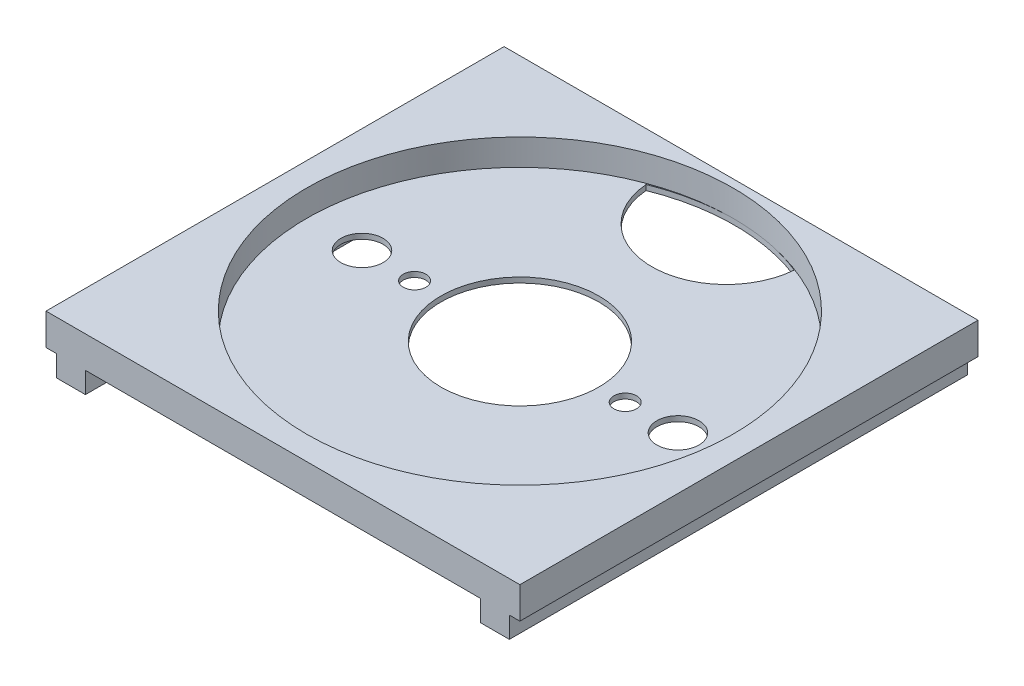
ISO-10303-21;
HEADER;
FILE_DESCRIPTION(('STEP AP214'),'2;1');
FILE_NAME('part.step','',(''),(''),'','','');
FILE_SCHEMA(('AUTOMOTIVE_DESIGN { 1 0 10303 214 1 1 1 1 }'));
ENDSEC;
DATA;
#1=APPLICATION_CONTEXT('core data for automotive mechanical design processes');
#2=APPLICATION_PROTOCOL_DEFINITION('international standard','automotive_design',2000,#1);
#3=PRODUCT_CONTEXT('',#1,'mechanical');
#4=PRODUCT('Part','Part','',(#3));
#5=PRODUCT_RELATED_PRODUCT_CATEGORY('part','',(#4));
#6=PRODUCT_DEFINITION_FORMATION('','',#4);
#7=PRODUCT_DEFINITION_CONTEXT('part definition',#1,'design');
#8=PRODUCT_DEFINITION('design','',#6,#7);
#9=PRODUCT_DEFINITION_SHAPE('','',#8);
#10=(LENGTH_UNIT() NAMED_UNIT(*) SI_UNIT(.MILLI.,.METRE.));
#11=(NAMED_UNIT(*) PLANE_ANGLE_UNIT() SI_UNIT($,.RADIAN.));
#12=(NAMED_UNIT(*) SI_UNIT($,.STERADIAN.) SOLID_ANGLE_UNIT());
#13=UNCERTAINTY_MEASURE_WITH_UNIT(LENGTH_MEASURE(1.E-05),#10,'distance_accuracy_value','');
#14=(GEOMETRIC_REPRESENTATION_CONTEXT(3) GLOBAL_UNCERTAINTY_ASSIGNED_CONTEXT((#13)) GLOBAL_UNIT_ASSIGNED_CONTEXT((#10,
#11,#12)) REPRESENTATION_CONTEXT('',''));
#15=CARTESIAN_POINT('',(0.,0.,0.));
#16=DIRECTION('',(0.,0.,1.));
#17=DIRECTION('',(1.,0.,0.));
#18=AXIS2_PLACEMENT_3D('',#15,#16,#17);
#19=CARTESIAN_POINT('',(0.,5.,0.));
#20=DIRECTION('',(0.,1.,0.));
#21=DIRECTION('',(0.,0.,1.));
#22=AXIS2_PLACEMENT_3D('',#19,#20,#21);
#23=CYLINDRICAL_SURFACE('',#22,40.5);
#24=CARTESIAN_POINT('',(0.,5.,0.));
#25=DIRECTION('',(0.,1.,0.));
#26=DIRECTION('',(0.,0.,1.));
#27=AXIS2_PLACEMENT_3D('',#24,#25,#26);
#28=CIRCLE('',#27,40.5);
#29=CARTESIAN_POINT('',(7.96690062199776,5.,-39.7086702683332));
#30=VERTEX_POINT('',#29);
#31=CARTESIAN_POINT('',(-0.453204015702651,5.,-40.4974641937017));
#32=VERTEX_POINT('',#31);
#33=EDGE_CURVE('E340',#30,#32,#28,.T.);
#34=ORIENTED_EDGE('',*,*,#33,.F.);
#35=EDGE_CURVE('E225',#32,#30,#28,.T.);
#36=ORIENTED_EDGE('',*,*,#35,.F.);
#37=EDGE_LOOP('',(#34,#36));
#38=FACE_BOUND('',#37,.T.);
#39=CARTESIAN_POINT('',(0.,10.,0.));
#40=DIRECTION('',(0.,1.,0.));
#41=DIRECTION('',(0.,0.,1.));
#42=AXIS2_PLACEMENT_3D('',#39,#40,#41);
#43=CIRCLE('',#42,40.5);
#44=CARTESIAN_POINT('',(0.,10.,40.5));
#45=VERTEX_POINT('',#44);
#46=EDGE_CURVE('E185',#45,#45,#43,.T.);
#47=ORIENTED_EDGE('',*,*,#46,.T.);
#48=EDGE_LOOP('',(#47));
#49=FACE_BOUND('',#48,.T.);
#50=ADVANCED_FACE('F55',(#38,#49),#23,.F.);
#51=CARTESIAN_POINT('',(20.,3.,0.));
#52=DIRECTION('',(0.,1.,0.));
#53=DIRECTION('',(0.,0.,1.));
#54=AXIS2_PLACEMENT_3D('',#51,#52,#53);
#55=CYLINDRICAL_SURFACE('',#54,2.15);
#56=CARTESIAN_POINT('',(20.,5.,0.));
#57=DIRECTION('',(0.,1.,0.));
#58=DIRECTION('',(0.,0.,1.));
#59=AXIS2_PLACEMENT_3D('',#56,#57,#58);
#60=CIRCLE('',#59,2.15);
#61=CARTESIAN_POINT('',(20.,5.,2.15));
#62=VERTEX_POINT('',#61);
#63=EDGE_CURVE('E353',#62,#62,#60,.T.);
#64=ORIENTED_EDGE('',*,*,#63,.T.);
#65=EDGE_LOOP('',(#64));
#66=FACE_BOUND('',#65,.T.);
#67=CARTESIAN_POINT('',(20.,4.,0.));
#68=DIRECTION('',(0.,-1.,0.));
#69=DIRECTION('',(0.,0.,-1.));
#70=AXIS2_PLACEMENT_3D('',#67,#68,#69);
#71=CIRCLE('',#70,2.15);
#72=CARTESIAN_POINT('',(20.,4.,-2.15));
#73=VERTEX_POINT('',#72);
#74=EDGE_CURVE('E319',#73,#73,#71,.F.);
#75=ORIENTED_EDGE('',*,*,#74,.F.);
#76=EDGE_LOOP('',(#75));
#77=FACE_BOUND('',#76,.T.);
#78=ADVANCED_FACE('F425',(#66,#77),#55,.F.);
#79=CARTESIAN_POINT('',(-20.,3.,0.));
#80=DIRECTION('',(0.,1.,0.));
#81=DIRECTION('',(0.,0.,1.));
#82=AXIS2_PLACEMENT_3D('',#79,#80,#81);
#83=CYLINDRICAL_SURFACE('',#82,2.15);
#84=CARTESIAN_POINT('',(-20.,5.,0.));
#85=DIRECTION('',(0.,1.,0.));
#86=DIRECTION('',(0.,0.,1.));
#87=AXIS2_PLACEMENT_3D('',#84,#85,#86);
#88=CIRCLE('',#87,2.15);
#89=CARTESIAN_POINT('',(-20.,5.,2.15));
#90=VERTEX_POINT('',#89);
#91=EDGE_CURVE('E349',#90,#90,#88,.T.);
#92=ORIENTED_EDGE('',*,*,#91,.T.);
#93=EDGE_LOOP('',(#92));
#94=FACE_BOUND('',#93,.T.);
#95=CARTESIAN_POINT('',(-20.,4.,0.));
#96=DIRECTION('',(0.,-1.,0.));
#97=DIRECTION('',(0.,0.,-1.));
#98=AXIS2_PLACEMENT_3D('',#95,#96,#97);
#99=CIRCLE('',#98,2.15);
#100=CARTESIAN_POINT('',(-20.,4.,-2.15));
#101=VERTEX_POINT('',#100);
#102=EDGE_CURVE('E230',#101,#101,#99,.F.);
#103=ORIENTED_EDGE('',*,*,#102,.F.);
#104=EDGE_LOOP('',(#103));
#105=FACE_BOUND('',#104,.T.);
#106=ADVANCED_FACE('F612',(#94,#105),#83,.F.);
#107=CARTESIAN_POINT('',(0.,0.,0.));
#108=DIRECTION('',(0.,1.,0.));
#109=DIRECTION('',(0.,0.,1.));
#110=AXIS2_PLACEMENT_3D('',#107,#108,#109);
#111=CYLINDRICAL_SURFACE('',#110,15.);
#112=CARTESIAN_POINT('',(0.,5.,0.));
#113=DIRECTION('',(0.,1.,0.));
#114=DIRECTION('',(0.,0.,1.));
#115=AXIS2_PLACEMENT_3D('',#112,#113,#114);
#116=CIRCLE('',#115,15.);
#117=CARTESIAN_POINT('',(0.,5.,15.));
#118=VERTEX_POINT('',#117);
#119=EDGE_CURVE('E345',#118,#118,#116,.T.);
#120=ORIENTED_EDGE('',*,*,#119,.T.);
#121=EDGE_LOOP('',(#120));
#122=FACE_BOUND('',#121,.T.);
#123=CARTESIAN_POINT('',(0.,4.,0.));
#124=DIRECTION('',(0.,-1.,0.));
#125=DIRECTION('',(0.,0.,-1.));
#126=AXIS2_PLACEMENT_3D('',#123,#124,#125);
#127=CIRCLE('',#126,15.);
#128=CARTESIAN_POINT('',(0.,4.,-15.));
#129=VERTEX_POINT('',#128);
#130=EDGE_CURVE('E226',#129,#129,#127,.F.);
#131=ORIENTED_EDGE('',*,*,#130,.F.);
#132=EDGE_LOOP('',(#131));
#133=FACE_BOUND('',#132,.T.);
#134=ADVANCED_FACE('F446',(#122,#133),#111,.F.);
#135=CARTESIAN_POINT('',(30.0323396507021,-5.,0.0225134709915971));
#136=DIRECTION('',(0.,1.,0.));
#137=DIRECTION('',(0.,0.,1.));
#138=AXIS2_PLACEMENT_3D('',#135,#136,#137);
#139=CYLINDRICAL_SURFACE('',#138,4.00000000000001);
#140=CARTESIAN_POINT('',(30.0323396507021,4.,0.0225134709915971));
#141=DIRECTION('',(0.,-1.,0.));
#142=DIRECTION('',(0.,0.,-1.));
#143=AXIS2_PLACEMENT_3D('',#140,#141,#142);
#144=CIRCLE('',#143,4.00000000000001);
#145=CARTESIAN_POINT('',(30.0323396507021,4.,-3.97748652900842));
#146=VERTEX_POINT('',#145);
#147=EDGE_CURVE('E237',#146,#146,#144,.T.);
#148=ORIENTED_EDGE('',*,*,#147,.T.);
#149=EDGE_LOOP('',(#148));
#150=FACE_BOUND('',#149,.T.);
#151=CARTESIAN_POINT('',(30.0323396507021,5.,0.0225134709915971));
#152=DIRECTION('',(0.,1.,0.));
#153=DIRECTION('',(0.,0.,1.));
#154=AXIS2_PLACEMENT_3D('',#151,#152,#153);
#155=CIRCLE('',#154,4.00000000000001);
#156=CARTESIAN_POINT('',(30.0323396507021,5.,4.02251347099161));
#157=VERTEX_POINT('',#156);
#158=EDGE_CURVE('E232',#157,#157,#155,.T.);
#159=ORIENTED_EDGE('',*,*,#158,.T.);
#160=EDGE_LOOP('',(#159));
#161=FACE_BOUND('',#160,.T.);
#162=ADVANCED_FACE('F390',(#150,#161),#139,.F.);
#163=CARTESIAN_POINT('',(0.234545087504077,5.,-20.721427314011));
#164=DIRECTION('',(0.,1.,0.));
#165=DIRECTION('',(0.,0.,1.));
#166=AXIS2_PLACEMENT_3D('',#163,#164,#165);
#167=PLANE('',#166);
#168=CARTESIAN_POINT('',(0.234545087504078,5.,-2.50368837224554));
#169=DIRECTION('',(0.,-1.,0.));
#170=DIRECTION('',(0.,0.,-1.));
#171=AXIS2_PLACEMENT_3D('',#168,#169,#170);
#172=CIRCLE('',#171,38.0000000000004);
#173=EDGE_CURVE('E236',#32,#30,#172,.T.);
#174=ORIENTED_EDGE('',*,*,#173,.T.);
#175=ORIENTED_EDGE('',*,*,#33,.T.);
#176=EDGE_LOOP('',(#174,#175));
#177=FACE_BOUND('',#176,.T.);
#178=ADVANCED_FACE('F419',(#177),#167,.F.);
#179=CARTESIAN_POINT('',(0.,5.,0.));
#180=DIRECTION('',(0.,1.,0.));
#181=DIRECTION('',(0.,0.,1.));
#182=AXIS2_PLACEMENT_3D('',#179,#180,#181);
#183=PLANE('',#182);
#184=CARTESIAN_POINT('',(-29.9676603492979,5.,0.0225134709915971));
#185=DIRECTION('',(0.,1.,0.));
#186=DIRECTION('',(0.,0.,1.));
#187=AXIS2_PLACEMENT_3D('',#184,#185,#186);
#188=CIRCLE('',#187,4.);
#189=CARTESIAN_POINT('',(-29.9676603492979,5.,4.0225134709916));
#190=VERTEX_POINT('',#189);
#191=EDGE_CURVE('E238',#190,#190,#188,.T.);
#192=ORIENTED_EDGE('',*,*,#191,.F.);
#193=EDGE_LOOP('',(#192));
#194=FACE_BOUND('',#193,.T.);
#195=ORIENTED_EDGE('',*,*,#158,.F.);
#196=EDGE_LOOP('',(#195));
#197=FACE_BOUND('',#196,.T.);
#198=ORIENTED_EDGE('',*,*,#119,.F.);
#199=EDGE_LOOP('',(#198));
#200=FACE_BOUND('',#199,.T.);
#201=ORIENTED_EDGE('',*,*,#91,.F.);
#202=EDGE_LOOP('',(#201));
#203=FACE_BOUND('',#202,.T.);
#204=ORIENTED_EDGE('',*,*,#63,.F.);
#205=EDGE_LOOP('',(#204));
#206=FACE_BOUND('',#205,.T.);
#207=CARTESIAN_POINT('',(0.234545087504076,5.,-38.9391662557764));
#208=DIRECTION('',(0.,1.,0.));
#209=DIRECTION('',(0.,0.,1.));
#210=AXIS2_PLACEMENT_3D('',#207,#208,#209);
#211=CIRCLE('',#210,14.1220477581371);
#212=CARTESIAN_POINT('',(-13.8415216151434,5.,-37.800491997824));
#213=VERTEX_POINT('',#212);
#214=CARTESIAN_POINT('',(14.3106117901516,5.,-37.800491997824));
#215=VERTEX_POINT('',#214);
#216=EDGE_CURVE('E331',#213,#215,#211,.T.);
#217=ORIENTED_EDGE('',*,*,#216,.F.);
#218=EDGE_CURVE('E336',#213,#32,#172,.T.);
#219=ORIENTED_EDGE('',*,*,#218,.T.);
#220=ORIENTED_EDGE('',*,*,#35,.T.);
#221=CARTESIAN_POINT('',(0.234545087504078,5.,-2.50368837224554));
#222=DIRECTION('',(0.,1.,0.));
#223=DIRECTION('',(0.,0.,1.));
#224=AXIS2_PLACEMENT_3D('',#221,#222,#223);
#225=CIRCLE('',#224,38.0000000000004);
#226=EDGE_CURVE('E220',#30,#215,#225,.F.);
#227=ORIENTED_EDGE('',*,*,#226,.T.);
#228=EDGE_LOOP('',(#217,#219,#220,#227));
#229=FACE_BOUND('',#228,.T.);
#230=ADVANCED_FACE('F413',(#194,#197,#200,#203,#206,#229),#183,.T.);
#231=CARTESIAN_POINT('',(0.234545087504078,-61.,-2.50368837224554));
#232=DIRECTION('',(0.,1.,0.));
#233=DIRECTION('',(0.,0.,1.));
#234=AXIS2_PLACEMENT_3D('',#231,#232,#233);
#235=CYLINDRICAL_SURFACE('',#234,38.0000000000004);
#236=DIRECTION('',(0.,1.,0.));
#237=VECTOR('',#236,1.);
#238=CARTESIAN_POINT('',(-13.8415216151434,-61.,-37.800491997824));
#239=LINE('',#238,#237);
#240=CARTESIAN_POINT('',(-13.8415216151434,4.00000000000007,-37.800491997824));
#241=VERTEX_POINT('',#240);
#242=EDGE_CURVE('E335',#241,#213,#239,.T.);
#243=ORIENTED_EDGE('',*,*,#242,.F.);
#244=CARTESIAN_POINT('',(0.234545087504078,4.00000000000012,-2.50368837224554));
#245=DIRECTION('',(0.,-1.,0.));
#246=DIRECTION('',(1.,0.,0.));
#247=AXIS2_PLACEMENT_3D('',#244,#245,#246);
#248=CIRCLE('',#247,38.0000000000004);
#249=CARTESIAN_POINT('',(14.3106117901516,4.00000000000025,-37.800491997824));
#250=VERTEX_POINT('',#249);
#251=EDGE_CURVE('E224',#241,#250,#248,.T.);
#252=ORIENTED_EDGE('',*,*,#251,.T.);
#253=DIRECTION('',(0.,1.,0.));
#254=VECTOR('',#253,1.);
#255=CARTESIAN_POINT('',(14.3106117901516,-61.,-37.800491997824));
#256=LINE('',#255,#254);
#257=EDGE_CURVE('E250',#250,#215,#256,.T.);
#258=ORIENTED_EDGE('',*,*,#257,.T.);
#259=ORIENTED_EDGE('',*,*,#226,.F.);
#260=ORIENTED_EDGE('',*,*,#173,.F.);
#261=ORIENTED_EDGE('',*,*,#218,.F.);
#262=EDGE_LOOP('',(#243,#252,#258,#259,#260,#261));
#263=FACE_BOUND('',#262,.T.);
#264=ADVANCED_FACE('F407',(#263),#235,.F.);
#265=CARTESIAN_POINT('',(0.234545087504076,-61.,-38.9391662557764));
#266=DIRECTION('',(0.,1.,0.));
#267=DIRECTION('',(0.,0.,1.));
#268=AXIS2_PLACEMENT_3D('',#265,#266,#267);
#269=CYLINDRICAL_SURFACE('',#268,14.1220477581371);
#270=CARTESIAN_POINT('',(0.234545087504076,4.00000000000012,-38.9391662557764));
#271=DIRECTION('',(0.,-1.,0.));
#272=DIRECTION('',(1.,0.,0.));
#273=AXIS2_PLACEMENT_3D('',#270,#271,#272);
#274=CIRCLE('',#273,14.1220477581371);
#275=EDGE_CURVE('E243',#241,#250,#274,.F.);
#276=ORIENTED_EDGE('',*,*,#275,.F.);
#277=ORIENTED_EDGE('',*,*,#242,.T.);
#278=ORIENTED_EDGE('',*,*,#216,.T.);
#279=ORIENTED_EDGE('',*,*,#257,.F.);
#280=EDGE_LOOP('',(#276,#277,#278,#279));
#281=FACE_BOUND('',#280,.T.);
#282=ADVANCED_FACE('F409',(#281),#269,.F.);
#283=CARTESIAN_POINT('',(-29.9676603492979,-5.,0.0225134709915971));
#284=DIRECTION('',(0.,1.,0.));
#285=DIRECTION('',(0.,0.,1.));
#286=AXIS2_PLACEMENT_3D('',#283,#284,#285);
#287=CYLINDRICAL_SURFACE('',#286,4.);
#288=CARTESIAN_POINT('',(-29.9676603492979,4.,0.0225134709915971));
#289=DIRECTION('',(0.,-1.,0.));
#290=DIRECTION('',(0.,0.,-1.));
#291=AXIS2_PLACEMENT_3D('',#288,#289,#290);
#292=CIRCLE('',#291,4.);
#293=CARTESIAN_POINT('',(-29.9676603492979,4.,-3.9774865290084));
#294=VERTEX_POINT('',#293);
#295=EDGE_CURVE('E242',#294,#294,#292,.T.);
#296=ORIENTED_EDGE('',*,*,#295,.T.);
#297=EDGE_LOOP('',(#296));
#298=FACE_BOUND('',#297,.T.);
#299=ORIENTED_EDGE('',*,*,#191,.T.);
#300=EDGE_LOOP('',(#299));
#301=FACE_BOUND('',#300,.T.);
#302=ADVANCED_FACE('F430',(#298,#301),#287,.F.);
#303=CARTESIAN_POINT('',(0.,10.,0.));
#304=DIRECTION('',(0.,-1.,0.));
#305=DIRECTION('',(0.,0.,-1.));
#306=AXIS2_PLACEMENT_3D('',#303,#304,#305);
#307=PLANE('',#306);
#308=ORIENTED_EDGE('',*,*,#46,.F.);
#309=EDGE_LOOP('',(#308));
#310=FACE_BOUND('',#309,.T.);
#311=DIRECTION('',(0.,0.,-1.));
#312=VECTOR('',#311,1.);
#313=CARTESIAN_POINT('',(45.,10.,-45.));
#314=LINE('',#313,#312);
#315=CARTESIAN_POINT('',(45.,10.,45.));
#316=VERTEX_POINT('',#315);
#317=CARTESIAN_POINT('',(45.,10.,-42.));
#318=VERTEX_POINT('',#317);
#319=EDGE_CURVE('E193',#316,#318,#314,.T.);
#320=ORIENTED_EDGE('',*,*,#319,.T.);
#321=DIRECTION('',(-1.,0.,0.));
#322=VECTOR('',#321,1.);
#323=CARTESIAN_POINT('',(45.,10.,-42.));
#324=LINE('',#323,#322);
#325=CARTESIAN_POINT('',(-45.,10.,-42.));
#326=VERTEX_POINT('',#325);
#327=EDGE_CURVE('E174',#318,#326,#324,.T.);
#328=ORIENTED_EDGE('',*,*,#327,.T.);
#329=DIRECTION('',(0.,0.,1.));
#330=VECTOR('',#329,1.);
#331=CARTESIAN_POINT('',(-45.,10.,45.));
#332=LINE('',#331,#330);
#333=CARTESIAN_POINT('',(-45.,10.,45.));
#334=VERTEX_POINT('',#333);
#335=EDGE_CURVE('E209',#326,#334,#332,.T.);
#336=ORIENTED_EDGE('',*,*,#335,.T.);
#337=DIRECTION('',(1.,0.,0.));
#338=VECTOR('',#337,1.);
#339=CARTESIAN_POINT('',(0.,10.,45.));
#340=LINE('',#339,#338);
#341=EDGE_CURVE('E200',#334,#316,#340,.T.);
#342=ORIENTED_EDGE('',*,*,#341,.T.);
#343=EDGE_LOOP('',(#320,#328,#336,#342));
#344=FACE_BOUND('',#343,.T.);
#345=ADVANCED_FACE('F198',(#310,#344),#307,.F.);
#346=CARTESIAN_POINT('',(-45.,10.,45.));
#347=DIRECTION('',(1.,0.,0.));
#348=DIRECTION('',(0.,0.,-1.));
#349=AXIS2_PLACEMENT_3D('',#346,#347,#348);
#350=PLANE('',#349);
#351=ORIENTED_EDGE('',*,*,#335,.F.);
#352=DIRECTION('',(0.,1.,0.));
#353=VECTOR('',#352,1.);
#354=CARTESIAN_POINT('',(-45.,0.,-42.));
#355=LINE('',#354,#353);
#356=CARTESIAN_POINT('',(-45.,4.,-42.));
#357=VERTEX_POINT('',#356);
#358=EDGE_CURVE('E180',#357,#326,#355,.T.);
#359=ORIENTED_EDGE('',*,*,#358,.F.);
#360=DIRECTION('',(0.,0.,1.));
#361=VECTOR('',#360,1.);
#362=CARTESIAN_POINT('',(-45.,4.,-42.));
#363=LINE('',#362,#361);
#364=CARTESIAN_POINT('',(-45.,4.,45.));
#365=VERTEX_POINT('',#364);
#366=EDGE_CURVE('E203',#357,#365,#363,.T.);
#367=ORIENTED_EDGE('',*,*,#366,.T.);
#368=DIRECTION('',(0.,-1.,0.));
#369=VECTOR('',#368,1.);
#370=CARTESIAN_POINT('',(-45.,10.,45.));
#371=LINE('',#370,#369);
#372=EDGE_CURVE('E215',#334,#365,#371,.T.);
#373=ORIENTED_EDGE('',*,*,#372,.F.);
#374=EDGE_LOOP('',(#351,#359,#367,#373));
#375=FACE_BOUND('',#374,.T.);
#376=ADVANCED_FACE('F364',(#375),#350,.F.);
#377=CARTESIAN_POINT('',(45.,10.,-45.));
#378=DIRECTION('',(-1.,0.,0.));
#379=DIRECTION('',(0.,0.,1.));
#380=AXIS2_PLACEMENT_3D('',#377,#378,#379);
#381=PLANE('',#380);
#382=DIRECTION('',(0.,0.,1.));
#383=VECTOR('',#382,1.);
#384=CARTESIAN_POINT('',(45.,4.00000000000032,-42.));
#385=LINE('',#384,#383);
#386=CARTESIAN_POINT('',(45.,4.00000000000031,-42.));
#387=VERTEX_POINT('',#386);
#388=CARTESIAN_POINT('',(45.,4.00000000000032,45.));
#389=VERTEX_POINT('',#388);
#390=EDGE_CURVE('E194',#387,#389,#385,.T.);
#391=ORIENTED_EDGE('',*,*,#390,.F.);
#392=DIRECTION('',(0.,1.,0.));
#393=VECTOR('',#392,1.);
#394=CARTESIAN_POINT('',(45.,0.,-42.));
#395=LINE('',#394,#393);
#396=EDGE_CURVE('E177',#387,#318,#395,.T.);
#397=ORIENTED_EDGE('',*,*,#396,.T.);
#398=ORIENTED_EDGE('',*,*,#319,.F.);
#399=DIRECTION('',(0.,-1.,0.));
#400=VECTOR('',#399,1.);
#401=CARTESIAN_POINT('',(45.,10.,45.));
#402=LINE('',#401,#400);
#403=EDGE_CURVE('E207',#316,#389,#402,.T.);
#404=ORIENTED_EDGE('',*,*,#403,.T.);
#405=EDGE_LOOP('',(#391,#397,#398,#404));
#406=FACE_BOUND('',#405,.T.);
#407=ADVANCED_FACE('F191',(#406),#381,.F.);
#408=CARTESIAN_POINT('',(45.,10.,45.));
#409=DIRECTION('',(0.,0.,-1.));
#410=DIRECTION('',(-1.,0.,0.));
#411=AXIS2_PLACEMENT_3D('',#408,#409,#410);
#412=PLANE('',#411);
#413=ORIENTED_EDGE('',*,*,#372,.T.);
#414=DIRECTION('',(-1.,0.,0.));
#415=VECTOR('',#414,1.);
#416=CARTESIAN_POINT('',(-43.,4.,45.));
#417=LINE('',#416,#415);
#418=CARTESIAN_POINT('',(-43.,4.,45.));
#419=VERTEX_POINT('',#418);
#420=EDGE_CURVE('E111',#419,#365,#417,.T.);
#421=ORIENTED_EDGE('',*,*,#420,.F.);
#422=DIRECTION('',(0.,-1.,0.));
#423=VECTOR('',#422,1.);
#424=CARTESIAN_POINT('',(-43.,4.,45.));
#425=LINE('',#424,#423);
#426=CARTESIAN_POINT('',(-43.,0.,45.));
#427=VERTEX_POINT('',#426);
#428=EDGE_CURVE('E219',#419,#427,#425,.T.);
#429=ORIENTED_EDGE('',*,*,#428,.T.);
#430=DIRECTION('',(1.,0.,0.));
#431=VECTOR('',#430,1.);
#432=CARTESIAN_POINT('',(-43.,0.,45.));
#433=LINE('',#432,#431);
#434=CARTESIAN_POINT('',(-37.5165528603111,0.,45.));
#435=VERTEX_POINT('',#434);
#436=EDGE_CURVE('E282',#427,#435,#433,.T.);
#437=ORIENTED_EDGE('',*,*,#436,.T.);
#438=DIRECTION('',(0.,1.,0.));
#439=VECTOR('',#438,1.);
#440=CARTESIAN_POINT('',(-37.5165528603111,0.,45.));
#441=LINE('',#440,#439);
#442=CARTESIAN_POINT('',(-37.5165528603111,4.,45.));
#443=VERTEX_POINT('',#442);
#444=EDGE_CURVE('E286',#435,#443,#441,.T.);
#445=ORIENTED_EDGE('',*,*,#444,.T.);
#446=DIRECTION('',(1.,0.,0.));
#447=VECTOR('',#446,1.);
#448=CARTESIAN_POINT('',(-37.5165528603111,4.,45.));
#449=LINE('',#448,#447);
#450=CARTESIAN_POINT('',(37.5165528603111,4.00000000000026,45.));
#451=VERTEX_POINT('',#450);
#452=EDGE_CURVE('E290',#443,#451,#449,.T.);
#453=ORIENTED_EDGE('',*,*,#452,.T.);
#454=DIRECTION('',(0.,1.,0.));
#455=VECTOR('',#454,1.);
#456=CARTESIAN_POINT('',(37.5165528603112,2.60208521396521E-13,45.));
#457=LINE('',#456,#455);
#458=CARTESIAN_POINT('',(37.5165528603112,2.60208521396521E-13,45.));
#459=VERTEX_POINT('',#458);
#460=EDGE_CURVE('E260',#459,#451,#457,.T.);
#461=ORIENTED_EDGE('',*,*,#460,.F.);
#462=DIRECTION('',(-1.,0.,0.));
#463=VECTOR('',#462,1.);
#464=CARTESIAN_POINT('',(43.,2.98372437868011E-13,45.));
#465=LINE('',#464,#463);
#466=CARTESIAN_POINT('',(43.,2.98372437868011E-13,45.));
#467=VERTEX_POINT('',#466);
#468=EDGE_CURVE('E255',#467,#459,#465,.T.);
#469=ORIENTED_EDGE('',*,*,#468,.F.);
#470=DIRECTION('',(0.,-1.,0.));
#471=VECTOR('',#470,1.);
#472=CARTESIAN_POINT('',(43.,4.0000000000003,45.));
#473=LINE('',#472,#471);
#474=CARTESIAN_POINT('',(43.,4.0000000000003,45.));
#475=VERTEX_POINT('',#474);
#476=EDGE_CURVE('E256',#475,#467,#473,.T.);
#477=ORIENTED_EDGE('',*,*,#476,.F.);
#478=DIRECTION('',(1.,0.,0.));
#479=VECTOR('',#478,1.);
#480=CARTESIAN_POINT('',(43.,4.0000000000003,45.));
#481=LINE('',#480,#479);
#482=EDGE_CURVE('E231',#475,#389,#481,.T.);
#483=ORIENTED_EDGE('',*,*,#482,.T.);
#484=ORIENTED_EDGE('',*,*,#403,.F.);
#485=ORIENTED_EDGE('',*,*,#341,.F.);
#486=EDGE_LOOP('',(#413,#421,#429,#437,#445,#453,#461,#469,#477,#483,#484,#485));
#487=FACE_BOUND('',#486,.T.);
#488=ADVANCED_FACE('F366',(#487),#412,.F.);
#489=CARTESIAN_POINT('',(-35.,4.,-23.));
#490=DIRECTION('',(0.,-1.,0.));
#491=DIRECTION('',(0.,0.,-1.));
#492=AXIS2_PLACEMENT_3D('',#489,#490,#491);
#493=PLANE('',#492);
#494=DIRECTION('',(0.,0.,1.));
#495=VECTOR('',#494,1.);
#496=CARTESIAN_POINT('',(37.5165528603111,4.00000000000026,-42.));
#497=LINE('',#496,#495);
#498=CARTESIAN_POINT('',(37.5165528603111,4.,-42.));
#499=VERTEX_POINT('',#498);
#500=EDGE_CURVE('E246',#499,#451,#497,.T.);
#501=ORIENTED_EDGE('',*,*,#500,.T.);
#502=ORIENTED_EDGE('',*,*,#452,.F.);
#503=DIRECTION('',(0.,0.,1.));
#504=VECTOR('',#503,1.);
#505=CARTESIAN_POINT('',(-37.5165528603111,4.,-42.));
#506=LINE('',#505,#504);
#507=CARTESIAN_POINT('',(-37.5165528603111,4.,-42.));
#508=VERTEX_POINT('',#507);
#509=EDGE_CURVE('E269',#508,#443,#506,.T.);
#510=ORIENTED_EDGE('',*,*,#509,.F.);
#511=DIRECTION('',(1.,0.,0.));
#512=VECTOR('',#511,1.);
#513=CARTESIAN_POINT('',(-37.5165528603111,4.,-42.));
#514=LINE('',#513,#512);
#515=EDGE_CURVE('E268',#508,#499,#514,.T.);
#516=ORIENTED_EDGE('',*,*,#515,.T.);
#517=EDGE_LOOP('',(#501,#502,#510,#516));
#518=FACE_BOUND('',#517,.T.);
#519=ORIENTED_EDGE('',*,*,#295,.F.);
#520=EDGE_LOOP('',(#519));
#521=FACE_BOUND('',#520,.T.);
#522=ORIENTED_EDGE('',*,*,#147,.F.);
#523=EDGE_LOOP('',(#522));
#524=FACE_BOUND('',#523,.T.);
#525=ORIENTED_EDGE('',*,*,#130,.T.);
#526=EDGE_LOOP('',(#525));
#527=FACE_BOUND('',#526,.T.);
#528=ORIENTED_EDGE('',*,*,#102,.T.);
#529=EDGE_LOOP('',(#528));
#530=FACE_BOUND('',#529,.T.);
#531=ORIENTED_EDGE('',*,*,#74,.T.);
#532=EDGE_LOOP('',(#531));
#533=FACE_BOUND('',#532,.T.);
#534=ORIENTED_EDGE('',*,*,#275,.T.);
#535=ORIENTED_EDGE('',*,*,#251,.F.);
#536=EDGE_LOOP('',(#534,#535));
#537=FACE_BOUND('',#536,.T.);
#538=ADVANCED_FACE('F393',(#518,#521,#524,#527,#530,#533,#537),#493,.T.);
#539=CARTESIAN_POINT('',(43.,4.0000000000003,-42.));
#540=DIRECTION('',(0.,-1.,0.));
#541=DIRECTION('',(1.,0.,0.));
#542=AXIS2_PLACEMENT_3D('',#539,#540,#541);
#543=PLANE('',#542);
#544=ORIENTED_EDGE('',*,*,#482,.F.);
#545=DIRECTION('',(0.,0.,1.));
#546=VECTOR('',#545,1.);
#547=CARTESIAN_POINT('',(43.,4.0000000000003,-42.));
#548=LINE('',#547,#546);
#549=CARTESIAN_POINT('',(43.,4.0000000000003,-42.));
#550=VERTEX_POINT('',#549);
#551=EDGE_CURVE('E100',#550,#475,#548,.T.);
#552=ORIENTED_EDGE('',*,*,#551,.F.);
#553=DIRECTION('',(1.,0.,0.));
#554=VECTOR('',#553,1.);
#555=CARTESIAN_POINT('',(43.,4.0000000000003,-42.));
#556=LINE('',#555,#554);
#557=EDGE_CURVE('E59',#550,#387,#556,.T.);
#558=ORIENTED_EDGE('',*,*,#557,.T.);
#559=ORIENTED_EDGE('',*,*,#390,.T.);
#560=EDGE_LOOP('',(#544,#552,#558,#559));
#561=FACE_BOUND('',#560,.T.);
#562=ADVANCED_FACE('F370',(#561),#543,.T.);
#563=CARTESIAN_POINT('',(-43.,4.,-42.));
#564=DIRECTION('',(0.,1.,0.));
#565=DIRECTION('',(0.,0.,1.));
#566=AXIS2_PLACEMENT_3D('',#563,#564,#565);
#567=PLANE('',#566);
#568=ORIENTED_EDGE('',*,*,#420,.T.);
#569=ORIENTED_EDGE('',*,*,#366,.F.);
#570=DIRECTION('',(-1.,0.,0.));
#571=VECTOR('',#570,1.);
#572=CARTESIAN_POINT('',(-43.,4.,-42.));
#573=LINE('',#572,#571);
#574=CARTESIAN_POINT('',(-43.,4.,-42.));
#575=VERTEX_POINT('',#574);
#576=EDGE_CURVE('E304',#575,#357,#573,.T.);
#577=ORIENTED_EDGE('',*,*,#576,.F.);
#578=DIRECTION('',(0.,0.,1.));
#579=VECTOR('',#578,1.);
#580=CARTESIAN_POINT('',(-43.,4.,-42.));
#581=LINE('',#580,#579);
#582=EDGE_CURVE('E108',#575,#419,#581,.T.);
#583=ORIENTED_EDGE('',*,*,#582,.T.);
#584=EDGE_LOOP('',(#568,#569,#577,#583));
#585=FACE_BOUND('',#584,.T.);
#586=ADVANCED_FACE('F57',(#585),#567,.F.);
#587=CARTESIAN_POINT('',(43.,4.0000000000003,-42.));
#588=DIRECTION('',(-1.,0.,0.));
#589=DIRECTION('',(0.,-1.,0.));
#590=AXIS2_PLACEMENT_3D('',#587,#588,#589);
#591=PLANE('',#590);
#592=ORIENTED_EDGE('',*,*,#476,.T.);
#593=DIRECTION('',(0.,0.,1.));
#594=VECTOR('',#593,1.);
#595=CARTESIAN_POINT('',(43.,2.98372437868011E-13,-42.));
#596=LINE('',#595,#594);
#597=CARTESIAN_POINT('',(43.,0.,-42.));
#598=VERTEX_POINT('',#597);
#599=EDGE_CURVE('E257',#598,#467,#596,.T.);
#600=ORIENTED_EDGE('',*,*,#599,.F.);
#601=DIRECTION('',(0.,-1.,0.));
#602=VECTOR('',#601,1.);
#603=CARTESIAN_POINT('',(43.,4.0000000000003,-42.));
#604=LINE('',#603,#602);
#605=EDGE_CURVE('E317',#550,#598,#604,.T.);
#606=ORIENTED_EDGE('',*,*,#605,.F.);
#607=ORIENTED_EDGE('',*,*,#551,.T.);
#608=EDGE_LOOP('',(#592,#600,#606,#607));
#609=FACE_BOUND('',#608,.T.);
#610=ADVANCED_FACE('F373',(#609),#591,.F.);
#611=CARTESIAN_POINT('',(43.,2.98372437868011E-13,-42.));
#612=DIRECTION('',(0.,1.,0.));
#613=DIRECTION('',(-1.,0.,0.));
#614=AXIS2_PLACEMENT_3D('',#611,#612,#613);
#615=PLANE('',#614);
#616=DIRECTION('',(0.,0.,1.));
#617=VECTOR('',#616,1.);
#618=CARTESIAN_POINT('',(37.5165528603112,2.60208521396521E-13,-42.));
#619=LINE('',#618,#617);
#620=CARTESIAN_POINT('',(37.5165528603112,0.,-42.));
#621=VERTEX_POINT('',#620);
#622=EDGE_CURVE('E261',#621,#459,#619,.T.);
#623=ORIENTED_EDGE('',*,*,#622,.F.);
#624=DIRECTION('',(-1.,0.,0.));
#625=VECTOR('',#624,1.);
#626=CARTESIAN_POINT('',(45.,0.,-42.));
#627=LINE('',#626,#625);
#628=EDGE_CURVE('E186',#598,#621,#627,.T.);
#629=ORIENTED_EDGE('',*,*,#628,.F.);
#630=ORIENTED_EDGE('',*,*,#599,.T.);
#631=ORIENTED_EDGE('',*,*,#468,.T.);
#632=EDGE_LOOP('',(#623,#629,#630,#631));
#633=FACE_BOUND('',#632,.T.);
#634=ADVANCED_FACE('F376',(#633),#615,.F.);
#635=CARTESIAN_POINT('',(37.5165528603112,2.60208521396521E-13,-42.));
#636=DIRECTION('',(1.,0.,0.));
#637=DIRECTION('',(0.,1.,0.));
#638=AXIS2_PLACEMENT_3D('',#635,#636,#637);
#639=PLANE('',#638);
#640=ORIENTED_EDGE('',*,*,#460,.T.);
#641=ORIENTED_EDGE('',*,*,#500,.F.);
#642=DIRECTION('',(0.,1.,0.));
#643=VECTOR('',#642,1.);
#644=CARTESIAN_POINT('',(37.5165528603112,2.60208521396521E-13,-42.));
#645=LINE('',#644,#643);
#646=EDGE_CURVE('E307',#621,#499,#645,.T.);
#647=ORIENTED_EDGE('',*,*,#646,.F.);
#648=ORIENTED_EDGE('',*,*,#622,.T.);
#649=EDGE_LOOP('',(#640,#641,#647,#648));
#650=FACE_BOUND('',#649,.T.);
#651=ADVANCED_FACE('F454',(#650),#639,.F.);
#652=CARTESIAN_POINT('',(-37.5165528603111,0.,-42.));
#653=DIRECTION('',(1.,0.,0.));
#654=DIRECTION('',(0.,0.,-1.));
#655=AXIS2_PLACEMENT_3D('',#652,#653,#654);
#656=PLANE('',#655);
#657=ORIENTED_EDGE('',*,*,#444,.F.);
#658=DIRECTION('',(0.,0.,1.));
#659=VECTOR('',#658,1.);
#660=CARTESIAN_POINT('',(-37.5165528603111,0.,-42.));
#661=LINE('',#660,#659);
#662=CARTESIAN_POINT('',(-37.5165528603111,0.,-42.));
#663=VERTEX_POINT('',#662);
#664=EDGE_CURVE('E272',#663,#435,#661,.T.);
#665=ORIENTED_EDGE('',*,*,#664,.F.);
#666=DIRECTION('',(0.,1.,0.));
#667=VECTOR('',#666,1.);
#668=CARTESIAN_POINT('',(-37.5165528603111,0.,-42.));
#669=LINE('',#668,#667);
#670=EDGE_CURVE('E264',#663,#508,#669,.T.);
#671=ORIENTED_EDGE('',*,*,#670,.T.);
#672=ORIENTED_EDGE('',*,*,#509,.T.);
#673=EDGE_LOOP('',(#657,#665,#671,#672));
#674=FACE_BOUND('',#673,.T.);
#675=ADVANCED_FACE('F457',(#674),#656,.T.);
#676=CARTESIAN_POINT('',(-43.,0.,-42.));
#677=DIRECTION('',(0.,-1.,0.));
#678=DIRECTION('',(0.,0.,-1.));
#679=AXIS2_PLACEMENT_3D('',#676,#677,#678);
#680=PLANE('',#679);
#681=CARTESIAN_POINT('',(-43.,0.,-42.));
#682=VERTEX_POINT('',#681);
#683=EDGE_CURVE('E196',#663,#682,#627,.T.);
#684=ORIENTED_EDGE('',*,*,#683,.F.);
#685=ORIENTED_EDGE('',*,*,#664,.T.);
#686=ORIENTED_EDGE('',*,*,#436,.F.);
#687=DIRECTION('',(0.,0.,1.));
#688=VECTOR('',#687,1.);
#689=CARTESIAN_POINT('',(-43.,0.,-42.));
#690=LINE('',#689,#688);
#691=EDGE_CURVE('E12',#682,#427,#690,.T.);
#692=ORIENTED_EDGE('',*,*,#691,.F.);
#693=EDGE_LOOP('',(#684,#685,#686,#692));
#694=FACE_BOUND('',#693,.T.);
#695=ADVANCED_FACE('F461',(#694),#680,.T.);
#696=CARTESIAN_POINT('',(-43.,4.,-42.));
#697=DIRECTION('',(-1.,0.,0.));
#698=DIRECTION('',(0.,0.,1.));
#699=AXIS2_PLACEMENT_3D('',#696,#697,#698);
#700=PLANE('',#699);
#701=ORIENTED_EDGE('',*,*,#428,.F.);
#702=ORIENTED_EDGE('',*,*,#582,.F.);
#703=DIRECTION('',(0.,-1.,0.));
#704=VECTOR('',#703,1.);
#705=CARTESIAN_POINT('',(-43.,4.,-42.));
#706=LINE('',#705,#704);
#707=EDGE_CURVE('E66',#575,#682,#706,.T.);
#708=ORIENTED_EDGE('',*,*,#707,.T.);
#709=ORIENTED_EDGE('',*,*,#691,.T.);
#710=EDGE_LOOP('',(#701,#702,#708,#709));
#711=FACE_BOUND('',#710,.T.);
#712=ADVANCED_FACE('F464',(#711),#700,.T.);
#713=CARTESIAN_POINT('',(45.,0.,-42.));
#714=DIRECTION('',(0.,0.,1.));
#715=DIRECTION('',(1.,0.,0.));
#716=AXIS2_PLACEMENT_3D('',#713,#714,#715);
#717=PLANE('',#716);
#718=ORIENTED_EDGE('',*,*,#557,.F.);
#719=ORIENTED_EDGE('',*,*,#605,.T.);
#720=ORIENTED_EDGE('',*,*,#628,.T.);
#721=ORIENTED_EDGE('',*,*,#646,.T.);
#722=ORIENTED_EDGE('',*,*,#515,.F.);
#723=ORIENTED_EDGE('',*,*,#670,.F.);
#724=ORIENTED_EDGE('',*,*,#683,.T.);
#725=ORIENTED_EDGE('',*,*,#707,.F.);
#726=ORIENTED_EDGE('',*,*,#576,.T.);
#727=ORIENTED_EDGE('',*,*,#358,.T.);
#728=ORIENTED_EDGE('',*,*,#327,.F.);
#729=ORIENTED_EDGE('',*,*,#396,.F.);
#730=EDGE_LOOP('',(#718,#719,#720,#721,#722,#723,#724,#725,#726,#727,#728,#729));
#731=FACE_BOUND('',#730,.T.);
#732=ADVANCED_FACE('F176',(#731),#717,.F.);
#733=CLOSED_SHELL('',(#50,#78,#106,#134,#162,#178,#230,#264,#282,#302,#345,#376,#407,#488,#538,
#562,#586,#610,#634,#651,#675,#695,#712,#732));
#734=MANIFOLD_SOLID_BREP('B2',#733);
#735=CARTESIAN_POINT('',(20.5883063186897,-14.7282144381696,-41.));
#736=CARTESIAN_POINT('',(20.5998029432433,-14.686551564445,-41.));
#737=CARTESIAN_POINT('',(20.6219302447279,-14.606363943868,-41.));
#738=CARTESIAN_POINT('',(20.6681666091743,-14.495323053424,-41.));
#739=CARTESIAN_POINT('',(20.7202381498704,-14.3966351524144,-41.));
#740=CARTESIAN_POINT('',(20.7818598812453,-14.3110555193583,-41.));
#741=CARTESIAN_POINT('',(20.8516786068719,-14.2350520063761,-41.));
#742=CARTESIAN_POINT('',(20.9323237895198,-14.1686334212084,-41.));
#743=CARTESIAN_POINT('',(21.0227596830129,-14.1092159701409,-41.));
#744=CARTESIAN_POINT('',(21.1225188236908,-14.0590634706741,-41.));
#745=CARTESIAN_POINT('',(21.2281606087667,-14.0163736119517,-41.));
#746=CARTESIAN_POINT('',(21.3387668007382,-13.9877484962021,-41.));
#747=CARTESIAN_POINT('',(21.451624588609,-13.9681389539024,-41.));
#748=CARTESIAN_POINT('',(21.5279588749567,-13.9663128454716,-41.));
#749=CARTESIAN_POINT('',(21.5663712225359,-13.965393925349,-41.));
#750=B_SPLINE_CURVE_WITH_KNOTS('',3,(#735,#736,#737,#738,#739,#740,#741,#742,#743,#744,#745,
#746,#747,#748,#749),.UNSPECIFIED.,.F.,.F.,(4,1,1,1,1,1,1,1,1,1,1,1,4),(0.,0.0962401251801507,
0.185231261128701,0.267500523077439,0.344400381777777,0.419594868555729,0.496890626592777,
0.576637918838516,0.660267852419639,0.745386615087629,0.830040327386452,0.914474211638802,1.),.UNSPECIFIED.);
#751=DIRECTION('',(0.,0.,-1.));
#752=VECTOR('',#751,1.);
#753=SURFACE_OF_LINEAR_EXTRUSION('',#750,#752);
#754=DIRECTION('',(0.,0.,-1.));
#755=VECTOR('',#754,1.);
#756=CARTESIAN_POINT('',(21.5663712225359,-13.965393925349,-41.));
#757=LINE('',#756,#755);
#758=CARTESIAN_POINT('',(21.5663712225359,-13.965393925349,-41.83));
#759=VERTEX_POINT('',#758);
#760=CARTESIAN_POINT('',(21.5663712225359,-13.965393925349,-42.));
#761=VERTEX_POINT('',#760);
#762=EDGE_CURVE('E726',#759,#761,#757,.T.);
#763=ORIENTED_EDGE('',*,*,#762,.T.);
#764=CARTESIAN_POINT('',(20.5883063186897,-14.7282144381696,-42.));
#765=CARTESIAN_POINT('',(20.5998029432433,-14.686551564445,-42.));
#766=CARTESIAN_POINT('',(20.6219302447279,-14.606363943868,-42.));
#767=CARTESIAN_POINT('',(20.6681666091743,-14.495323053424,-42.));
#768=CARTESIAN_POINT('',(20.7202381498704,-14.3966351524144,-42.));
#769=CARTESIAN_POINT('',(20.7818598812453,-14.3110555193583,-42.));
#770=CARTESIAN_POINT('',(20.8516786068719,-14.2350520063761,-42.));
#771=CARTESIAN_POINT('',(20.9323237895198,-14.1686334212084,-42.));
#772=CARTESIAN_POINT('',(21.0227596830129,-14.1092159701409,-42.));
#773=CARTESIAN_POINT('',(21.1225188236908,-14.0590634706741,-42.));
#774=CARTESIAN_POINT('',(21.2281606087667,-14.0163736119517,-42.));
#775=CARTESIAN_POINT('',(21.3387668007382,-13.9877484962021,-42.));
#776=CARTESIAN_POINT('',(21.451624588609,-13.9681389539024,-42.));
#777=CARTESIAN_POINT('',(21.5279588749567,-13.9663128454716,-42.));
#778=CARTESIAN_POINT('',(21.5663712225359,-13.965393925349,-42.));
#779=B_SPLINE_CURVE_WITH_KNOTS('',3,(#764,#765,#766,#767,#768,#769,#770,#771,#772,#773,#774,
#775,#776,#777,#778),.UNSPECIFIED.,.F.,.F.,(4,1,1,1,1,1,1,1,1,1,1,1,4),(0.,0.0962401251801507,
0.185231261128701,0.267500523077439,0.344400381777777,0.419594868555729,0.496890626592777,
0.576637918838516,0.660267852419639,0.745386615087629,0.830040327386452,0.914474211638802,1.),.UNSPECIFIED.);
#780=CARTESIAN_POINT('',(20.5883063186897,-14.7282144381696,-42.));
#781=VERTEX_POINT('',#780);
#782=EDGE_CURVE('E716',#761,#781,#779,.F.);
#783=ORIENTED_EDGE('',*,*,#782,.T.);
#784=DIRECTION('',(0.,0.,-1.));
#785=VECTOR('',#784,1.);
#786=CARTESIAN_POINT('',(20.5883063186897,-14.7282144381696,-41.));
#787=LINE('',#786,#785);
#788=CARTESIAN_POINT('',(20.5883063186897,-14.7282144381696,-41.83));
#789=VERTEX_POINT('',#788);
#790=EDGE_CURVE('E685',#789,#781,#787,.T.);
#791=ORIENTED_EDGE('',*,*,#790,.F.);
#792=CARTESIAN_POINT('',(20.5883063186897,-14.7282144381696,-41.83));
#793=CARTESIAN_POINT('',(20.5998029432433,-14.686551564445,-41.83));
#794=CARTESIAN_POINT('',(20.6219302447279,-14.606363943868,-41.83));
#795=CARTESIAN_POINT('',(20.6681666091743,-14.495323053424,-41.83));
#796=CARTESIAN_POINT('',(20.7202381498704,-14.3966351524144,-41.83));
#797=CARTESIAN_POINT('',(20.7818598812453,-14.3110555193583,-41.83));
#798=CARTESIAN_POINT('',(20.8516786068719,-14.2350520063761,-41.83));
#799=CARTESIAN_POINT('',(20.9323237895198,-14.1686334212084,-41.83));
#800=CARTESIAN_POINT('',(21.0227596830129,-14.1092159701409,-41.83));
#801=CARTESIAN_POINT('',(21.1225188236908,-14.0590634706741,-41.83));
#802=CARTESIAN_POINT('',(21.2281606087667,-14.0163736119517,-41.83));
#803=CARTESIAN_POINT('',(21.3387668007382,-13.9877484962021,-41.83));
#804=CARTESIAN_POINT('',(21.451624588609,-13.9681389539024,-41.83));
#805=CARTESIAN_POINT('',(21.5279588749567,-13.9663128454716,-41.83));
#806=CARTESIAN_POINT('',(21.5663712225359,-13.965393925349,-41.83));
#807=B_SPLINE_CURVE_WITH_KNOTS('',3,(#792,#793,#794,#795,#796,#797,#798,#799,#800,#801,#802,
#803,#804,#805,#806),.UNSPECIFIED.,.F.,.F.,(4,1,1,1,1,1,1,1,1,1,1,1,4),(0.,0.0962401251801507,
0.185231261128701,0.267500523077439,0.344400381777777,0.419594868555729,0.496890626592777,
0.576637918838516,0.660267852419639,0.745386615087629,0.830040327386452,0.914474211638802,1.),.UNSPECIFIED.);
#808=EDGE_CURVE('E727',#759,#789,#807,.F.);
#809=ORIENTED_EDGE('',*,*,#808,.F.);
#810=EDGE_LOOP('',(#763,#783,#791,#809));
#811=FACE_BOUND('',#810,.T.);
#812=ADVANCED_FACE('F676',(#811),#753,.T.);
#813=CARTESIAN_POINT('',(21.5663712225359,-13.965393925349,-41.));
#814=CARTESIAN_POINT('',(21.5977206610524,-13.9660055968941,-41.));
#815=CARTESIAN_POINT('',(21.6596919101046,-13.9672147429411,-41.));
#816=CARTESIAN_POINT('',(21.7509929782978,-13.9786848722738,-41.));
#817=CARTESIAN_POINT('',(21.8386726772159,-13.9976447171457,-41.));
#818=CARTESIAN_POINT('',(21.9233779648273,-14.0236096737479,-41.));
#819=CARTESIAN_POINT('',(22.0039988331994,-14.0582182762506,-41.));
#820=CARTESIAN_POINT('',(22.0821936014181,-14.0988015028601,-41.));
#821=CARTESIAN_POINT('',(22.1559739976629,-14.1483430866626,-41.));
#822=CARTESIAN_POINT('',(22.20211529314,-14.1861019414948,-41.));
#823=CARTESIAN_POINT('',(22.2254257097154,-14.2051775791952,-41.));
#824=B_SPLINE_CURVE_WITH_KNOTS('',3,(#813,#814,#815,#816,#817,#818,#819,#820,#821,#822,#823),
.UNSPECIFIED.,.F.,.F.,(4,1,1,1,1,1,1,1,4),(0.,0.131091976256927,0.259141276328142,
0.384161763483405,0.505991952497776,0.629098089389857,0.750669123423712,0.874038937615127,1.),.UNSPECIFIED.);
#825=DIRECTION('',(0.,0.,-1.));
#826=VECTOR('',#825,1.);
#827=SURFACE_OF_LINEAR_EXTRUSION('',#824,#826);
#828=DIRECTION('',(0.,0.,-1.));
#829=VECTOR('',#828,1.);
#830=CARTESIAN_POINT('',(22.2254257097154,-14.2051775791952,-41.));
#831=LINE('',#830,#829);
#832=CARTESIAN_POINT('',(22.2254257097154,-14.2051775791952,-41.83));
#833=VERTEX_POINT('',#832);
#834=CARTESIAN_POINT('',(22.2254257097154,-14.2051775791952,-42.));
#835=VERTEX_POINT('',#834);
#836=EDGE_CURVE('E734',#833,#835,#831,.T.);
#837=ORIENTED_EDGE('',*,*,#836,.T.);
#838=CARTESIAN_POINT('',(21.5663712225359,-13.965393925349,-42.));
#839=CARTESIAN_POINT('',(21.5977206610524,-13.9660055968941,-42.));
#840=CARTESIAN_POINT('',(21.6596919101046,-13.9672147429411,-42.));
#841=CARTESIAN_POINT('',(21.7509929782978,-13.9786848722738,-42.));
#842=CARTESIAN_POINT('',(21.8386726772159,-13.9976447171457,-42.));
#843=CARTESIAN_POINT('',(21.9233779648273,-14.0236096737479,-42.));
#844=CARTESIAN_POINT('',(22.0039988331994,-14.0582182762506,-42.));
#845=CARTESIAN_POINT('',(22.0821936014181,-14.0988015028601,-42.));
#846=CARTESIAN_POINT('',(22.1559739976629,-14.1483430866626,-42.));
#847=CARTESIAN_POINT('',(22.20211529314,-14.1861019414948,-42.));
#848=CARTESIAN_POINT('',(22.2254257097154,-14.2051775791952,-42.));
#849=B_SPLINE_CURVE_WITH_KNOTS('',3,(#838,#839,#840,#841,#842,#843,#844,#845,#846,#847,#848),
.UNSPECIFIED.,.F.,.F.,(4,1,1,1,1,1,1,1,4),(0.,0.131091976256927,0.259141276328142,
0.384161763483405,0.505991952497776,0.629098089389857,0.750669123423712,0.874038937615127,1.),.UNSPECIFIED.);
#850=EDGE_CURVE('E728',#835,#761,#849,.F.);
#851=ORIENTED_EDGE('',*,*,#850,.T.);
#852=ORIENTED_EDGE('',*,*,#762,.F.);
#853=CARTESIAN_POINT('',(21.5663712225359,-13.965393925349,-41.83));
#854=CARTESIAN_POINT('',(21.5977206610524,-13.9660055968941,-41.83));
#855=CARTESIAN_POINT('',(21.6596919101046,-13.9672147429411,-41.83));
#856=CARTESIAN_POINT('',(21.7509929782978,-13.9786848722738,-41.83));
#857=CARTESIAN_POINT('',(21.8386726772159,-13.9976447171457,-41.83));
#858=CARTESIAN_POINT('',(21.9233779648273,-14.0236096737479,-41.83));
#859=CARTESIAN_POINT('',(22.0039988331994,-14.0582182762506,-41.83));
#860=CARTESIAN_POINT('',(22.0821936014181,-14.0988015028601,-41.83));
#861=CARTESIAN_POINT('',(22.1559739976629,-14.1483430866626,-41.83));
#862=CARTESIAN_POINT('',(22.20211529314,-14.1861019414948,-41.83));
#863=CARTESIAN_POINT('',(22.2254257097154,-14.2051775791952,-41.83));
#864=B_SPLINE_CURVE_WITH_KNOTS('',3,(#853,#854,#855,#856,#857,#858,#859,#860,#861,#862,#863),
.UNSPECIFIED.,.F.,.F.,(4,1,1,1,1,1,1,1,4),(0.,0.131091976256927,0.259141276328142,
0.384161763483405,0.505991952497776,0.629098089389857,0.750669123423712,0.874038937615127,1.),.UNSPECIFIED.);
#865=EDGE_CURVE('E699',#833,#759,#864,.F.);
#866=ORIENTED_EDGE('',*,*,#865,.F.);
#867=EDGE_LOOP('',(#837,#851,#852,#866));
#868=FACE_BOUND('',#867,.T.);
#869=ADVANCED_FACE('F758',(#868),#827,.T.);
#870=CARTESIAN_POINT('',(22.2254257097154,-14.2051775791952,-41.));
#871=CARTESIAN_POINT('',(22.2421189916797,-14.2202718948196,-41.));
#872=CARTESIAN_POINT('',(22.2759021259072,-14.2508191108734,-41.));
#873=CARTESIAN_POINT('',(22.3210426473965,-14.3034483174245,-41.));
#874=CARTESIAN_POINT('',(22.3642631200827,-14.3601998795865,-41.));
#875=CARTESIAN_POINT('',(22.4035967728353,-14.4232450041846,-41.));
#876=CARTESIAN_POINT('',(22.439674359295,-14.4918657831912,-41.));
#877=CARTESIAN_POINT('',(22.473434336476,-14.565483418426,-41.));
#878=CARTESIAN_POINT('',(22.5038207485576,-14.6446565486877,-41.));
#879=CARTESIAN_POINT('',(22.5209168585911,-14.6998289879159,-41.));
#880=CARTESIAN_POINT('',(22.5297125686897,-14.7282144381696,-41.));
#881=B_SPLINE_CURVE_WITH_KNOTS('',3,(#870,#871,#872,#873,#874,#875,#876,#877,#878,#879,#880),
.UNSPECIFIED.,.F.,.F.,(4,1,1,1,1,1,1,1,4),(0.,0.109983845111872,0.222580497363887,
0.338499870962446,0.458708565477636,0.585535346457999,0.717517742945893,0.854666819751023,1.),.UNSPECIFIED.);
#882=DIRECTION('',(0.,0.,-1.));
#883=VECTOR('',#882,1.);
#884=SURFACE_OF_LINEAR_EXTRUSION('',#881,#883);
#885=DIRECTION('',(0.,0.,-1.));
#886=VECTOR('',#885,1.);
#887=CARTESIAN_POINT('',(22.5297125686897,-14.7282144381696,-41.));
#888=LINE('',#887,#886);
#889=CARTESIAN_POINT('',(22.5297125686897,-14.7282144381696,-41.83));
#890=VERTEX_POINT('',#889);
#891=CARTESIAN_POINT('',(22.5297125686897,-14.7282144381696,-42.));
#892=VERTEX_POINT('',#891);
#893=EDGE_CURVE('E741',#890,#892,#888,.T.);
#894=ORIENTED_EDGE('',*,*,#893,.T.);
#895=CARTESIAN_POINT('',(22.2254257097154,-14.2051775791952,-42.));
#896=CARTESIAN_POINT('',(22.2421189916797,-14.2202718948196,-42.));
#897=CARTESIAN_POINT('',(22.2759021259072,-14.2508191108734,-42.));
#898=CARTESIAN_POINT('',(22.3210426473965,-14.3034483174245,-42.));
#899=CARTESIAN_POINT('',(22.3642631200827,-14.3601998795865,-42.));
#900=CARTESIAN_POINT('',(22.4035967728353,-14.4232450041846,-42.));
#901=CARTESIAN_POINT('',(22.439674359295,-14.4918657831912,-42.));
#902=CARTESIAN_POINT('',(22.473434336476,-14.565483418426,-42.));
#903=CARTESIAN_POINT('',(22.5038207485576,-14.6446565486877,-42.));
#904=CARTESIAN_POINT('',(22.5209168585911,-14.6998289879159,-42.));
#905=CARTESIAN_POINT('',(22.5297125686897,-14.7282144381696,-42.));
#906=B_SPLINE_CURVE_WITH_KNOTS('',3,(#895,#896,#897,#898,#899,#900,#901,#902,#903,#904,#905),
.UNSPECIFIED.,.F.,.F.,(4,1,1,1,1,1,1,1,4),(0.,0.109983845111872,0.222580497363887,
0.338499870962446,0.458708565477636,0.585535346457999,0.717517742945893,0.854666819751023,1.),.UNSPECIFIED.);
#907=EDGE_CURVE('E692',#892,#835,#906,.F.);
#908=ORIENTED_EDGE('',*,*,#907,.T.);
#909=ORIENTED_EDGE('',*,*,#836,.F.);
#910=CARTESIAN_POINT('',(22.2254257097154,-14.2051775791952,-41.83));
#911=CARTESIAN_POINT('',(22.2421189916797,-14.2202718948196,-41.83));
#912=CARTESIAN_POINT('',(22.2759021259072,-14.2508191108734,-41.83));
#913=CARTESIAN_POINT('',(22.3210426473965,-14.3034483174245,-41.83));
#914=CARTESIAN_POINT('',(22.3642631200827,-14.3601998795865,-41.83));
#915=CARTESIAN_POINT('',(22.4035967728353,-14.4232450041846,-41.83));
#916=CARTESIAN_POINT('',(22.439674359295,-14.4918657831912,-41.83));
#917=CARTESIAN_POINT('',(22.473434336476,-14.565483418426,-41.83));
#918=CARTESIAN_POINT('',(22.5038207485576,-14.6446565486877,-41.83));
#919=CARTESIAN_POINT('',(22.5209168585911,-14.6998289879159,-41.83));
#920=CARTESIAN_POINT('',(22.5297125686897,-14.7282144381696,-41.83));
#921=B_SPLINE_CURVE_WITH_KNOTS('',3,(#910,#911,#912,#913,#914,#915,#916,#917,#918,#919,#920),
.UNSPECIFIED.,.F.,.F.,(4,1,1,1,1,1,1,1,4),(0.,0.109983845111872,0.222580497363887,
0.338499870962446,0.458708565477636,0.585535346457999,0.717517742945893,0.854666819751023,1.),.UNSPECIFIED.);
#922=EDGE_CURVE('E810',#890,#833,#921,.F.);
#923=ORIENTED_EDGE('',*,*,#922,.F.);
#924=EDGE_LOOP('',(#894,#908,#909,#923));
#925=FACE_BOUND('',#924,.T.);
#926=ADVANCED_FACE('F678',(#925),#884,.T.);
#927=CARTESIAN_POINT('',(22.5297125686897,-14.7282144381696,-41.));
#928=DIRECTION('',(0.,-1.,0.));
#929=DIRECTION('',(0.,0.,-1.));
#930=AXIS2_PLACEMENT_3D('',#927,#928,#929);
#931=PLANE('',#930);
#932=ORIENTED_EDGE('',*,*,#790,.T.);
#933=DIRECTION('',(1.,0.,0.));
#934=VECTOR('',#933,1.);
#935=CARTESIAN_POINT('',(22.5297125686897,-14.7282144381696,-42.));
#936=LINE('',#935,#934);
#937=EDGE_CURVE('E53',#781,#892,#936,.T.);
#938=ORIENTED_EDGE('',*,*,#937,.T.);
#939=ORIENTED_EDGE('',*,*,#893,.F.);
#940=DIRECTION('',(1.,0.,0.));
#941=VECTOR('',#940,1.);
#942=CARTESIAN_POINT('',(22.5297125686897,-14.7282144381696,-41.83));
#943=LINE('',#942,#941);
#944=EDGE_CURVE('E732',#789,#890,#943,.T.);
#945=ORIENTED_EDGE('',*,*,#944,.F.);
#946=EDGE_LOOP('',(#932,#938,#939,#945));
#947=FACE_BOUND('',#946,.T.);
#948=ADVANCED_FACE('F731',(#947),#931,.T.);
#949=CARTESIAN_POINT('',(26.5,-1.70000000000001,-41.83));
#950=DIRECTION('',(0.,0.,-1.));
#951=DIRECTION('',(-1.,0.,0.));
#952=AXIS2_PLACEMENT_3D('',#949,#950,#951);
#953=PLANE('',#952);
#954=ORIENTED_EDGE('',*,*,#944,.T.);
#955=ORIENTED_EDGE('',*,*,#922,.T.);
#956=ORIENTED_EDGE('',*,*,#865,.T.);
#957=ORIENTED_EDGE('',*,*,#808,.T.);
#958=EDGE_LOOP('',(#954,#955,#956,#957));
#959=FACE_BOUND('',#958,.T.);
#960=ADVANCED_FACE('F766',(#959),#953,.F.);
#961=CARTESIAN_POINT('',(0.,0.,-42.));
#962=DIRECTION('',(0.,0.,-1.));
#963=DIRECTION('',(-1.,0.,0.));
#964=AXIS2_PLACEMENT_3D('',#961,#962,#963);
#965=PLANE('',#964);
#966=ORIENTED_EDGE('',*,*,#850,.F.);
#967=ORIENTED_EDGE('',*,*,#907,.F.);
#968=ORIENTED_EDGE('',*,*,#937,.F.);
#969=ORIENTED_EDGE('',*,*,#782,.F.);
#970=EDGE_LOOP('',(#966,#967,#968,#969));
#971=FACE_BOUND('',#970,.T.);
#972=ADVANCED_FACE('F715',(#971),#965,.T.);
#973=CLOSED_SHELL('',(#812,#869,#926,#948,#960,#972));
#974=MANIFOLD_SOLID_BREP('B6',#973);
#975=ADVANCED_BREP_SHAPE_REPRESENTATION('',(#18,#734,#974),#14);
#976=SHAPE_DEFINITION_REPRESENTATION(#9,#975);
ENDSEC;
END-ISO-10303-21;
